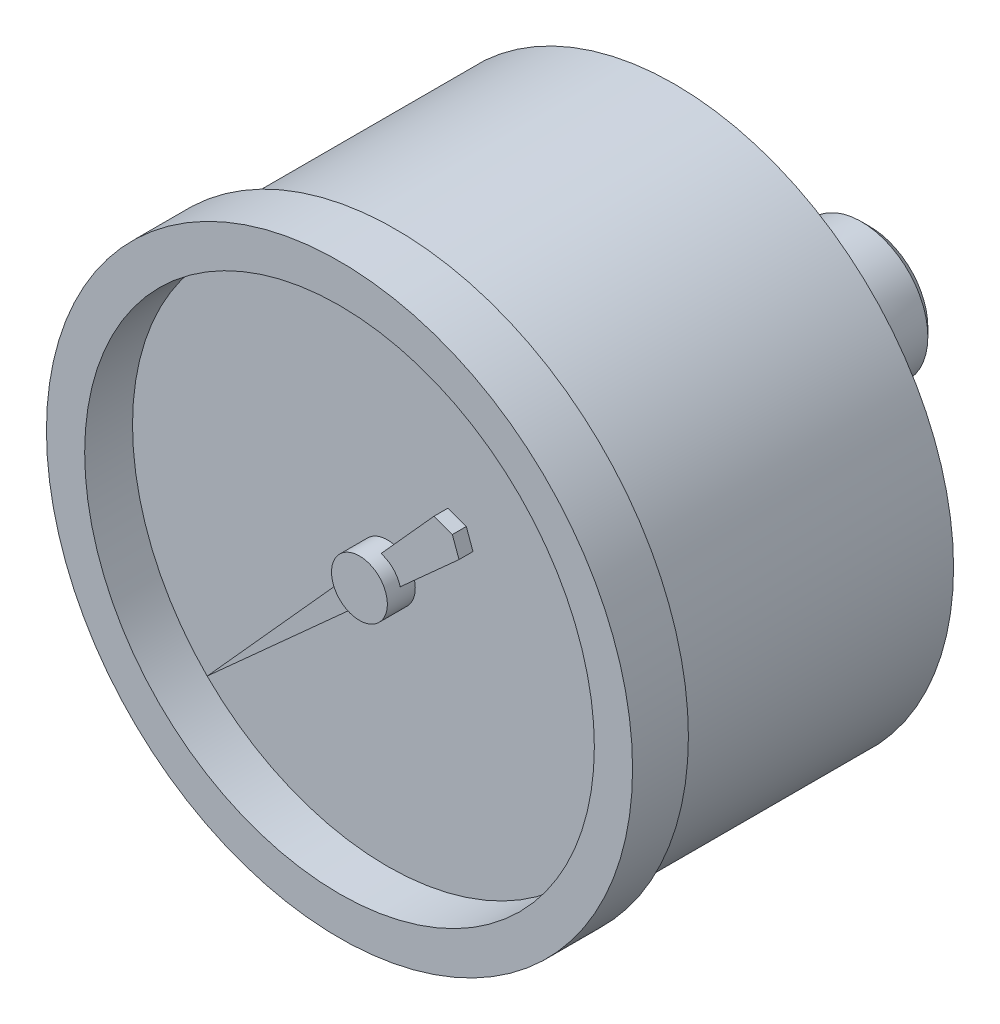
ISO-10303-21;
HEADER;
FILE_DESCRIPTION(('STEP AP214'),'2;1');
FILE_NAME('part.step','',(''),(''),'','','');
FILE_SCHEMA(('AUTOMOTIVE_DESIGN { 1 0 10303 214 1 1 1 1 }'));
ENDSEC;
DATA;
#1=APPLICATION_CONTEXT('core data for automotive mechanical design processes');
#2=APPLICATION_PROTOCOL_DEFINITION('international standard','automotive_design',2000,#1);
#3=PRODUCT_CONTEXT('',#1,'mechanical');
#4=PRODUCT('Part','Part','',(#3));
#5=PRODUCT_RELATED_PRODUCT_CATEGORY('part','',(#4));
#6=PRODUCT_DEFINITION_FORMATION('','',#4);
#7=PRODUCT_DEFINITION_CONTEXT('part definition',#1,'design');
#8=PRODUCT_DEFINITION('design','',#6,#7);
#9=PRODUCT_DEFINITION_SHAPE('','',#8);
#10=(LENGTH_UNIT() NAMED_UNIT(*) SI_UNIT(.MILLI.,.METRE.));
#11=(NAMED_UNIT(*) PLANE_ANGLE_UNIT() SI_UNIT($,.RADIAN.));
#12=(NAMED_UNIT(*) SI_UNIT($,.STERADIAN.) SOLID_ANGLE_UNIT());
#13=UNCERTAINTY_MEASURE_WITH_UNIT(LENGTH_MEASURE(1.E-05),#10,'distance_accuracy_value','');
#14=(GEOMETRIC_REPRESENTATION_CONTEXT(3) GLOBAL_UNCERTAINTY_ASSIGNED_CONTEXT((#13)) GLOBAL_UNIT_ASSIGNED_CONTEXT((#10,
#11,#12)) REPRESENTATION_CONTEXT('',''));
#15=CARTESIAN_POINT('',(0.,0.,0.));
#16=DIRECTION('',(0.,0.,1.));
#17=DIRECTION('',(1.,0.,0.));
#18=AXIS2_PLACEMENT_3D('',#15,#16,#17);
#19=CARTESIAN_POINT('',(0.,0.,0.));
#20=DIRECTION('',(0.,0.,1.));
#21=DIRECTION('',(1.,0.,0.));
#22=AXIS2_PLACEMENT_3D('',#19,#20,#21);
#23=CYLINDRICAL_SURFACE('',#22,7.58620689655172);
#24=CARTESIAN_POINT('',(0.,0.,8.4));
#25=DIRECTION('',(0.,0.,1.));
#26=DIRECTION('',(1.,0.,0.));
#27=AXIS2_PLACEMENT_3D('',#24,#25,#26);
#28=CIRCLE('',#27,7.58620689655172);
#29=CARTESIAN_POINT('',(-5.22499139494879,5.5,8.4));
#30=VERTEX_POINT('',#29);
#31=CARTESIAN_POINT('',(-5.5,5.22499139494879,8.4));
#32=VERTEX_POINT('',#31);
#33=EDGE_CURVE('E187',#30,#32,#28,.T.);
#34=ORIENTED_EDGE('',*,*,#33,.T.);
#35=DIRECTION('',(0.,0.,1.));
#36=VECTOR('',#35,1.);
#37=CARTESIAN_POINT('',(-5.5,5.22499139494879,0.));
#38=LINE('',#37,#36);
#39=CARTESIAN_POINT('',(-5.5,5.22499139494879,14.));
#40=VERTEX_POINT('',#39);
#41=EDGE_CURVE('E262',#32,#40,#38,.T.);
#42=ORIENTED_EDGE('',*,*,#41,.T.);
#43=CARTESIAN_POINT('',(0.,0.,14.));
#44=DIRECTION('',(0.,0.,1.));
#45=DIRECTION('',(1.,0.,0.));
#46=AXIS2_PLACEMENT_3D('',#43,#44,#45);
#47=CIRCLE('',#46,7.58620689655172);
#48=CARTESIAN_POINT('',(-5.22499139494879,5.5,14.));
#49=VERTEX_POINT('',#48);
#50=EDGE_CURVE('E176',#49,#40,#47,.T.);
#51=ORIENTED_EDGE('',*,*,#50,.F.);
#52=DIRECTION('',(0.,0.,1.));
#53=VECTOR('',#52,1.);
#54=CARTESIAN_POINT('',(-5.22499139494879,5.5,0.));
#55=LINE('',#54,#53);
#56=EDGE_CURVE('E153',#49,#30,#55,.F.);
#57=ORIENTED_EDGE('',*,*,#56,.T.);
#58=EDGE_LOOP('',(#34,#42,#51,#57));
#59=FACE_BOUND('',#58,.T.);
#60=ADVANCED_FACE('F35',(#59),#23,.T.);
#61=CARTESIAN_POINT('',(-5.5,-5.22499139494879,14.));
#62=VERTEX_POINT('',#61);
#63=CARTESIAN_POINT('',(-5.22499139494879,-5.5,14.));
#64=VERTEX_POINT('',#63);
#65=EDGE_CURVE('E182',#62,#64,#47,.T.);
#66=ORIENTED_EDGE('',*,*,#65,.F.);
#67=DIRECTION('',(0.,0.,1.));
#68=VECTOR('',#67,1.);
#69=CARTESIAN_POINT('',(-5.5,-5.22499139494879,0.));
#70=LINE('',#69,#68);
#71=CARTESIAN_POINT('',(-5.5,-5.22499139494879,8.4));
#72=VERTEX_POINT('',#71);
#73=EDGE_CURVE('E267',#62,#72,#70,.F.);
#74=ORIENTED_EDGE('',*,*,#73,.T.);
#75=CARTESIAN_POINT('',(-5.22499139494879,-5.5,8.4));
#76=VERTEX_POINT('',#75);
#77=EDGE_CURVE('E190',#72,#76,#28,.T.);
#78=ORIENTED_EDGE('',*,*,#77,.T.);
#79=DIRECTION('',(0.,0.,1.));
#80=VECTOR('',#79,1.);
#81=CARTESIAN_POINT('',(-5.22499139494879,-5.5,0.));
#82=LINE('',#81,#80);
#83=EDGE_CURVE('E58',#76,#64,#82,.T.);
#84=ORIENTED_EDGE('',*,*,#83,.T.);
#85=EDGE_LOOP('',(#66,#74,#78,#84));
#86=FACE_BOUND('',#85,.T.);
#87=ADVANCED_FACE('F283',(#86),#23,.T.);
#88=CARTESIAN_POINT('',(5.22499139494879,-5.5,14.));
#89=VERTEX_POINT('',#88);
#90=CARTESIAN_POINT('',(5.5,-5.22499139494879,14.));
#91=VERTEX_POINT('',#90);
#92=EDGE_CURVE('E178',#89,#91,#47,.T.);
#93=ORIENTED_EDGE('',*,*,#92,.F.);
#94=DIRECTION('',(0.,0.,1.));
#95=VECTOR('',#94,1.);
#96=CARTESIAN_POINT('',(5.22499139494879,-5.5,0.));
#97=LINE('',#96,#95);
#98=CARTESIAN_POINT('',(5.22499139494879,-5.5,8.4));
#99=VERTEX_POINT('',#98);
#100=EDGE_CURVE('E271',#89,#99,#97,.F.);
#101=ORIENTED_EDGE('',*,*,#100,.T.);
#102=CARTESIAN_POINT('',(5.5,-5.22499139494879,8.4));
#103=VERTEX_POINT('',#102);
#104=EDGE_CURVE('E188',#99,#103,#28,.T.);
#105=ORIENTED_EDGE('',*,*,#104,.T.);
#106=DIRECTION('',(0.,0.,1.));
#107=VECTOR('',#106,1.);
#108=CARTESIAN_POINT('',(5.5,-5.22499139494879,0.));
#109=LINE('',#108,#107);
#110=EDGE_CURVE('E50',#103,#91,#109,.T.);
#111=ORIENTED_EDGE('',*,*,#110,.T.);
#112=EDGE_LOOP('',(#93,#101,#105,#111));
#113=FACE_BOUND('',#112,.T.);
#114=ADVANCED_FACE('F325',(#113),#23,.T.);
#115=CARTESIAN_POINT('',(0.,0.,34.5714285714286));
#116=DIRECTION('',(0.,0.,-1.));
#117=DIRECTION('',(-1.,0.,0.));
#118=AXIS2_PLACEMENT_3D('',#115,#116,#117);
#119=PLANE('',#118);
#120=CARTESIAN_POINT('',(0.,0.,34.5714285714286));
#121=DIRECTION('',(0.,0.,1.));
#122=DIRECTION('',(1.,0.,0.));
#123=AXIS2_PLACEMENT_3D('',#120,#121,#122);
#124=CIRCLE('',#123,18.2608695652174);
#125=CARTESIAN_POINT('',(18.2608695652174,0.,34.5714285714286));
#126=VERTEX_POINT('',#125);
#127=EDGE_CURVE('E297',#126,#126,#124,.T.);
#128=ORIENTED_EDGE('',*,*,#127,.T.);
#129=EDGE_LOOP('',(#128));
#130=FACE_BOUND('',#129,.T.);
#131=CARTESIAN_POINT('',(0.,0.,34.5714285714286));
#132=DIRECTION('',(0.,0.,1.));
#133=DIRECTION('',(1.,0.,0.));
#134=AXIS2_PLACEMENT_3D('',#131,#132,#133);
#135=CIRCLE('',#134,2.);
#136=CARTESIAN_POINT('',(-0.7466307905966,-1.85540897446711,34.5714285714286));
#137=VERTEX_POINT('',#136);
#138=CARTESIAN_POINT('',(1.92328901913971,0.548597620170385,34.5714285714286));
#139=VERTEX_POINT('',#138);
#140=EDGE_CURVE('E258',#137,#139,#135,.T.);
#141=ORIENTED_EDGE('',*,*,#140,.F.);
#142=DIRECTION('',(0.743144825477394,0.669130606358858,0.));
#143=VECTOR('',#142,1.);
#144=CARTESIAN_POINT('',(-11.879393923934,-11.879393923934,34.5714285714286));
#145=LINE('',#144,#143);
#146=CARTESIAN_POINT('',(-11.879393923934,-11.879393923934,34.5714285714286));
#147=VERTEX_POINT('',#146);
#148=EDGE_CURVE('E228',#147,#137,#145,.T.);
#149=ORIENTED_EDGE('',*,*,#148,.F.);
#150=DIRECTION('',(-0.669130606358858,-0.743144825477394,0.));
#151=VECTOR('',#150,1.);
#152=CARTESIAN_POINT('',(4.34141195754811,6.13563608865501,34.5714285714286));
#153=LINE('',#152,#151);
#154=CARTESIAN_POINT('',(-1.85540897446711,-0.746630790596598,34.5714285714286));
#155=VERTEX_POINT('',#154);
#156=EDGE_CURVE('E235',#155,#147,#153,.T.);
#157=ORIENTED_EDGE('',*,*,#156,.F.);
#158=CARTESIAN_POINT('',(0.548597620170382,1.92328901913971,34.5714285714286));
#159=VERTEX_POINT('',#158);
#160=EDGE_CURVE('E261',#159,#155,#135,.T.);
#161=ORIENTED_EDGE('',*,*,#160,.F.);
#162=CARTESIAN_POINT('',(4.34141195754811,6.13563608865501,34.5714285714286));
#163=VERTEX_POINT('',#162);
#164=EDGE_CURVE('E232',#163,#159,#153,.T.);
#165=ORIENTED_EDGE('',*,*,#164,.F.);
#166=DIRECTION('',(-0.939692620785909,0.342020143325668,0.));
#167=VECTOR('',#166,1.);
#168=CARTESIAN_POINT('',(5.65685424949238,5.65685424949238,34.5714285714286));
#169=LINE('',#168,#167);
#170=CARTESIAN_POINT('',(5.65685424949238,5.65685424949238,34.5714285714286));
#171=VERTEX_POINT('',#170);
#172=EDGE_CURVE('E221',#171,#163,#169,.T.);
#173=ORIENTED_EDGE('',*,*,#172,.F.);
#174=DIRECTION('',(-0.342020143325667,0.939692620785909,0.));
#175=VECTOR('',#174,1.);
#176=CARTESIAN_POINT('',(6.135636088655,4.34141195754811,34.5714285714286));
#177=LINE('',#176,#175);
#178=CARTESIAN_POINT('',(6.135636088655,4.34141195754811,34.5714285714286));
#179=VERTEX_POINT('',#178);
#180=EDGE_CURVE('E225',#179,#171,#177,.T.);
#181=ORIENTED_EDGE('',*,*,#180,.F.);
#182=EDGE_CURVE('E231',#139,#179,#145,.T.);
#183=ORIENTED_EDGE('',*,*,#182,.F.);
#184=EDGE_LOOP('',(#141,#149,#157,#161,#165,#173,#181,#183));
#185=FACE_BOUND('',#184,.T.);
#186=ADVANCED_FACE('F37',(#130,#185),#119,.F.);
#187=CARTESIAN_POINT('',(4.34141195754811,6.13563608865501,35.5714285714286));
#188=DIRECTION('',(0.743144825477394,-0.669130606358858,0.));
#189=DIRECTION('',(0.669130606358858,0.743144825477394,0.));
#190=AXIS2_PLACEMENT_3D('',#187,#188,#189);
#191=PLANE('',#190);
#192=DIRECTION('',(0.,0.,-1.));
#193=VECTOR('',#192,1.);
#194=CARTESIAN_POINT('',(-1.85540897446711,-0.746630790596598,36.5714285714286));
#195=LINE('',#194,#193);
#196=CARTESIAN_POINT('',(-1.85540897446711,-0.746630790596598,35.5714285714286));
#197=VERTEX_POINT('',#196);
#198=EDGE_CURVE('E245',#155,#197,#195,.F.);
#199=ORIENTED_EDGE('',*,*,#198,.F.);
#200=ORIENTED_EDGE('',*,*,#156,.T.);
#201=DIRECTION('',(0.,0.,-1.));
#202=VECTOR('',#201,1.);
#203=CARTESIAN_POINT('',(-11.879393923934,-11.879393923934,35.5714285714286));
#204=LINE('',#203,#202);
#205=CARTESIAN_POINT('',(-11.879393923934,-11.879393923934,35.5714285714286));
#206=VERTEX_POINT('',#205);
#207=EDGE_CURVE('E208',#206,#147,#204,.T.);
#208=ORIENTED_EDGE('',*,*,#207,.F.);
#209=DIRECTION('',(-0.669130606358858,-0.743144825477394,0.));
#210=VECTOR('',#209,1.);
#211=CARTESIAN_POINT('',(4.34141195754811,6.13563608865501,35.5714285714286));
#212=LINE('',#211,#210);
#213=EDGE_CURVE('E224',#197,#206,#212,.T.);
#214=ORIENTED_EDGE('',*,*,#213,.F.);
#215=EDGE_LOOP('',(#199,#200,#208,#214));
#216=FACE_BOUND('',#215,.T.);
#217=ADVANCED_FACE('F347',(#216),#191,.F.);
#218=DIRECTION('',(0.,0.,-1.));
#219=VECTOR('',#218,1.);
#220=CARTESIAN_POINT('',(0.548597620170381,1.92328901913971,36.5714285714286));
#221=LINE('',#220,#219);
#222=CARTESIAN_POINT('',(0.548597620170381,1.92328901913971,35.5714285714286));
#223=VERTEX_POINT('',#222);
#224=EDGE_CURVE('E251',#223,#159,#221,.T.);
#225=ORIENTED_EDGE('',*,*,#224,.F.);
#226=CARTESIAN_POINT('',(4.34141195754811,6.13563608865501,35.5714285714286));
#227=VERTEX_POINT('',#226);
#228=EDGE_CURVE('E243',#227,#223,#212,.T.);
#229=ORIENTED_EDGE('',*,*,#228,.F.);
#230=DIRECTION('',(0.,0.,-1.));
#231=VECTOR('',#230,1.);
#232=CARTESIAN_POINT('',(4.34141195754811,6.13563608865501,35.5714285714286));
#233=LINE('',#232,#231);
#234=EDGE_CURVE('E217',#227,#163,#233,.T.);
#235=ORIENTED_EDGE('',*,*,#234,.T.);
#236=ORIENTED_EDGE('',*,*,#164,.T.);
#237=EDGE_LOOP('',(#225,#229,#235,#236));
#238=FACE_BOUND('',#237,.T.);
#239=ADVANCED_FACE('F350',(#238),#191,.F.);
#240=CARTESIAN_POINT('',(-11.879393923934,-11.879393923934,35.5714285714286));
#241=DIRECTION('',(-0.669130606358858,0.743144825477394,0.));
#242=DIRECTION('',(-0.743144825477394,-0.669130606358858,0.));
#243=AXIS2_PLACEMENT_3D('',#240,#241,#242);
#244=PLANE('',#243);
#245=DIRECTION('',(0.,0.,-1.));
#246=VECTOR('',#245,1.);
#247=CARTESIAN_POINT('',(1.92328901913971,0.548597620170383,36.5714285714286));
#248=LINE('',#247,#246);
#249=CARTESIAN_POINT('',(1.92328901913971,0.548597620170383,35.5714285714286));
#250=VERTEX_POINT('',#249);
#251=EDGE_CURVE('E254',#139,#250,#248,.F.);
#252=ORIENTED_EDGE('',*,*,#251,.F.);
#253=ORIENTED_EDGE('',*,*,#182,.T.);
#254=DIRECTION('',(0.,0.,-1.));
#255=VECTOR('',#254,1.);
#256=CARTESIAN_POINT('',(6.135636088655,4.34141195754811,35.5714285714286));
#257=LINE('',#256,#255);
#258=CARTESIAN_POINT('',(6.135636088655,4.34141195754811,35.5714285714286));
#259=VERTEX_POINT('',#258);
#260=EDGE_CURVE('E211',#259,#179,#257,.T.);
#261=ORIENTED_EDGE('',*,*,#260,.F.);
#262=DIRECTION('',(0.743144825477394,0.669130606358858,0.));
#263=VECTOR('',#262,1.);
#264=CARTESIAN_POINT('',(-11.879393923934,-11.879393923934,35.5714285714286));
#265=LINE('',#264,#263);
#266=EDGE_CURVE('E242',#250,#259,#265,.T.);
#267=ORIENTED_EDGE('',*,*,#266,.F.);
#268=EDGE_LOOP('',(#252,#253,#261,#267));
#269=FACE_BOUND('',#268,.T.);
#270=ADVANCED_FACE('F352',(#269),#244,.F.);
#271=DIRECTION('',(0.,0.,-1.));
#272=VECTOR('',#271,1.);
#273=CARTESIAN_POINT('',(-0.7466307905966,-1.85540897446711,36.5714285714286));
#274=LINE('',#273,#272);
#275=CARTESIAN_POINT('',(-0.7466307905966,-1.85540897446711,35.5714285714286));
#276=VERTEX_POINT('',#275);
#277=EDGE_CURVE('E248',#276,#137,#274,.T.);
#278=ORIENTED_EDGE('',*,*,#277,.F.);
#279=EDGE_CURVE('E239',#206,#276,#265,.T.);
#280=ORIENTED_EDGE('',*,*,#279,.F.);
#281=ORIENTED_EDGE('',*,*,#207,.T.);
#282=ORIENTED_EDGE('',*,*,#148,.T.);
#283=EDGE_LOOP('',(#278,#280,#281,#282));
#284=FACE_BOUND('',#283,.T.);
#285=ADVANCED_FACE('F355',(#284),#244,.F.);
#286=CARTESIAN_POINT('',(0.,0.,35.5714285714286));
#287=DIRECTION('',(0.,0.,-1.));
#288=DIRECTION('',(-1.,0.,0.));
#289=AXIS2_PLACEMENT_3D('',#286,#287,#288);
#290=PLANE('',#289);
#291=CARTESIAN_POINT('',(0.,0.,35.5714285714286));
#292=DIRECTION('',(0.,0.,-1.));
#293=DIRECTION('',(-1.,0.,0.));
#294=AXIS2_PLACEMENT_3D('',#291,#292,#293);
#295=CIRCLE('',#294,2.);
#296=EDGE_CURVE('E293',#197,#276,#295,.F.);
#297=ORIENTED_EDGE('',*,*,#296,.F.);
#298=ORIENTED_EDGE('',*,*,#213,.T.);
#299=ORIENTED_EDGE('',*,*,#279,.T.);
#300=EDGE_LOOP('',(#297,#298,#299));
#301=FACE_BOUND('',#300,.T.);
#302=ADVANCED_FACE('F365',(#301),#290,.F.);
#303=EDGE_CURVE('E294',#250,#223,#295,.F.);
#304=ORIENTED_EDGE('',*,*,#303,.F.);
#305=ORIENTED_EDGE('',*,*,#266,.T.);
#306=DIRECTION('',(-0.342020143325667,0.939692620785909,0.));
#307=VECTOR('',#306,1.);
#308=CARTESIAN_POINT('',(6.135636088655,4.34141195754811,35.5714285714286));
#309=LINE('',#308,#307);
#310=CARTESIAN_POINT('',(5.65685424949238,5.65685424949238,35.5714285714286));
#311=VERTEX_POINT('',#310);
#312=EDGE_CURVE('E237',#259,#311,#309,.T.);
#313=ORIENTED_EDGE('',*,*,#312,.T.);
#314=DIRECTION('',(-0.939692620785909,0.342020143325668,0.));
#315=VECTOR('',#314,1.);
#316=CARTESIAN_POINT('',(5.65685424949238,5.65685424949238,35.5714285714286));
#317=LINE('',#316,#315);
#318=EDGE_CURVE('E220',#311,#227,#317,.T.);
#319=ORIENTED_EDGE('',*,*,#318,.T.);
#320=ORIENTED_EDGE('',*,*,#228,.T.);
#321=EDGE_LOOP('',(#304,#305,#313,#319,#320));
#322=FACE_BOUND('',#321,.T.);
#323=ADVANCED_FACE('F368',(#322),#290,.F.);
#324=CARTESIAN_POINT('',(0.,0.,0.));
#325=DIRECTION('',(0.,0.,1.));
#326=DIRECTION('',(1.,0.,0.));
#327=AXIS2_PLACEMENT_3D('',#324,#325,#326);
#328=CYLINDRICAL_SURFACE('',#327,18.2608695652174);
#329=ORIENTED_EDGE('',*,*,#127,.F.);
#330=EDGE_LOOP('',(#329));
#331=FACE_BOUND('',#330,.T.);
#332=CARTESIAN_POINT('',(0.,0.,38.));
#333=DIRECTION('',(0.,0.,1.));
#334=DIRECTION('',(1.,0.,0.));
#335=AXIS2_PLACEMENT_3D('',#332,#333,#334);
#336=CIRCLE('',#335,18.2608695652174);
#337=CARTESIAN_POINT('',(18.2608695652174,0.,38.));
#338=VERTEX_POINT('',#337);
#339=EDGE_CURVE('E300',#338,#338,#336,.T.);
#340=ORIENTED_EDGE('',*,*,#339,.T.);
#341=EDGE_LOOP('',(#340));
#342=FACE_BOUND('',#341,.T.);
#343=ADVANCED_FACE('F414',(#331,#342),#328,.F.);
#344=CARTESIAN_POINT('',(0.,18.2608695652174,38.));
#345=DIRECTION('',(0.,0.,-1.));
#346=DIRECTION('',(-1.,0.,0.));
#347=AXIS2_PLACEMENT_3D('',#344,#345,#346);
#348=PLANE('',#347);
#349=ORIENTED_EDGE('',*,*,#339,.F.);
#350=EDGE_LOOP('',(#349));
#351=FACE_BOUND('',#350,.T.);
#352=CARTESIAN_POINT('',(0.,0.,38.));
#353=DIRECTION('',(0.,0.,1.));
#354=DIRECTION('',(1.,0.,0.));
#355=AXIS2_PLACEMENT_3D('',#352,#353,#354);
#356=CIRCLE('',#355,21.);
#357=CARTESIAN_POINT('',(21.,0.,38.));
#358=VERTEX_POINT('',#357);
#359=EDGE_CURVE('E303',#358,#358,#356,.T.);
#360=ORIENTED_EDGE('',*,*,#359,.T.);
#361=EDGE_LOOP('',(#360));
#362=FACE_BOUND('',#361,.T.);
#363=ADVANCED_FACE('F419',(#351,#362),#348,.F.);
#364=CARTESIAN_POINT('',(0.,0.,0.));
#365=DIRECTION('',(0.,0.,1.));
#366=DIRECTION('',(1.,0.,0.));
#367=AXIS2_PLACEMENT_3D('',#364,#365,#366);
#368=CYLINDRICAL_SURFACE('',#367,21.);
#369=ORIENTED_EDGE('',*,*,#359,.F.);
#370=EDGE_LOOP('',(#369));
#371=FACE_BOUND('',#370,.T.);
#372=CARTESIAN_POINT('',(0.,0.,34.));
#373=DIRECTION('',(0.,0.,1.));
#374=DIRECTION('',(1.,0.,0.));
#375=AXIS2_PLACEMENT_3D('',#372,#373,#374);
#376=CIRCLE('',#375,21.);
#377=CARTESIAN_POINT('',(21.,0.,34.));
#378=VERTEX_POINT('',#377);
#379=EDGE_CURVE('E306',#378,#378,#376,.T.);
#380=ORIENTED_EDGE('',*,*,#379,.T.);
#381=EDGE_LOOP('',(#380));
#382=FACE_BOUND('',#381,.T.);
#383=ADVANCED_FACE('F429',(#371,#382),#368,.T.);
#384=CARTESIAN_POINT('',(0.,21.,34.));
#385=DIRECTION('',(0.,0.,1.));
#386=DIRECTION('',(1.,0.,0.));
#387=AXIS2_PLACEMENT_3D('',#384,#385,#386);
#388=PLANE('',#387);
#389=ORIENTED_EDGE('',*,*,#379,.F.);
#390=EDGE_LOOP('',(#389));
#391=FACE_BOUND('',#390,.T.);
#392=CARTESIAN_POINT('',(0.,0.,34.));
#393=DIRECTION('',(0.,0.,1.));
#394=DIRECTION('',(1.,0.,0.));
#395=AXIS2_PLACEMENT_3D('',#392,#393,#394);
#396=CIRCLE('',#395,20.);
#397=CARTESIAN_POINT('',(20.,0.,34.));
#398=VERTEX_POINT('',#397);
#399=EDGE_CURVE('E180',#398,#398,#396,.T.);
#400=ORIENTED_EDGE('',*,*,#399,.T.);
#401=EDGE_LOOP('',(#400));
#402=FACE_BOUND('',#401,.T.);
#403=ADVANCED_FACE('F312',(#391,#402),#388,.F.);
#404=CARTESIAN_POINT('',(0.,0.,0.));
#405=DIRECTION('',(0.,0.,1.));
#406=DIRECTION('',(1.,0.,0.));
#407=AXIS2_PLACEMENT_3D('',#404,#405,#406);
#408=CYLINDRICAL_SURFACE('',#407,20.);
#409=ORIENTED_EDGE('',*,*,#399,.F.);
#410=EDGE_LOOP('',(#409));
#411=FACE_BOUND('',#410,.T.);
#412=CARTESIAN_POINT('',(0.,0.,14.));
#413=DIRECTION('',(0.,0.,1.));
#414=DIRECTION('',(1.,0.,0.));
#415=AXIS2_PLACEMENT_3D('',#412,#413,#414);
#416=CIRCLE('',#415,20.);
#417=CARTESIAN_POINT('',(20.,0.,14.));
#418=VERTEX_POINT('',#417);
#419=EDGE_CURVE('E175',#418,#418,#416,.T.);
#420=ORIENTED_EDGE('',*,*,#419,.T.);
#421=EDGE_LOOP('',(#420));
#422=FACE_BOUND('',#421,.T.);
#423=ADVANCED_FACE('F314',(#411,#422),#408,.T.);
#424=CARTESIAN_POINT('',(0.,20.,14.));
#425=DIRECTION('',(0.,0.,1.));
#426=DIRECTION('',(1.,0.,0.));
#427=AXIS2_PLACEMENT_3D('',#424,#425,#426);
#428=PLANE('',#427);
#429=DIRECTION('',(0.,-1.,0.));
#430=VECTOR('',#429,1.);
#431=CARTESIAN_POINT('',(-5.5,5.5,14.));
#432=LINE('',#431,#430);
#433=EDGE_CURVE('E279',#40,#62,#432,.T.);
#434=ORIENTED_EDGE('',*,*,#433,.T.);
#435=ORIENTED_EDGE('',*,*,#65,.T.);
#436=DIRECTION('',(1.,0.,0.));
#437=VECTOR('',#436,1.);
#438=CARTESIAN_POINT('',(-5.5,-5.5,14.));
#439=LINE('',#438,#437);
#440=EDGE_CURVE('E277',#64,#89,#439,.T.);
#441=ORIENTED_EDGE('',*,*,#440,.T.);
#442=ORIENTED_EDGE('',*,*,#92,.T.);
#443=DIRECTION('',(0.,1.,0.));
#444=VECTOR('',#443,1.);
#445=CARTESIAN_POINT('',(5.5,-5.5,14.));
#446=LINE('',#445,#444);
#447=CARTESIAN_POINT('',(5.5,5.22499139494879,14.));
#448=VERTEX_POINT('',#447);
#449=EDGE_CURVE('E158',#91,#448,#446,.T.);
#450=ORIENTED_EDGE('',*,*,#449,.T.);
#451=CARTESIAN_POINT('',(5.22499139494879,5.5,14.));
#452=VERTEX_POINT('',#451);
#453=EDGE_CURVE('E165',#448,#452,#47,.T.);
#454=ORIENTED_EDGE('',*,*,#453,.T.);
#455=DIRECTION('',(-1.,0.,0.));
#456=VECTOR('',#455,1.);
#457=CARTESIAN_POINT('',(5.5,5.5,14.));
#458=LINE('',#457,#456);
#459=EDGE_CURVE('E147',#452,#49,#458,.T.);
#460=ORIENTED_EDGE('',*,*,#459,.T.);
#461=ORIENTED_EDGE('',*,*,#50,.T.);
#462=EDGE_LOOP('',(#434,#435,#441,#442,#450,#454,#460,#461));
#463=FACE_BOUND('',#462,.T.);
#464=ORIENTED_EDGE('',*,*,#419,.F.);
#465=EDGE_LOOP('',(#464));
#466=FACE_BOUND('',#465,.T.);
#467=ADVANCED_FACE('F172',(#463,#466),#428,.F.);
#468=ORIENTED_EDGE('',*,*,#453,.F.);
#469=DIRECTION('',(0.,0.,1.));
#470=VECTOR('',#469,1.);
#471=CARTESIAN_POINT('',(5.5,5.22499139494879,0.));
#472=LINE('',#471,#470);
#473=CARTESIAN_POINT('',(5.5,5.22499139494879,8.4));
#474=VERTEX_POINT('',#473);
#475=EDGE_CURVE('E168',#448,#474,#472,.F.);
#476=ORIENTED_EDGE('',*,*,#475,.T.);
#477=CARTESIAN_POINT('',(5.22499139494879,5.5,8.4));
#478=VERTEX_POINT('',#477);
#479=EDGE_CURVE('E167',#474,#478,#28,.T.);
#480=ORIENTED_EDGE('',*,*,#479,.T.);
#481=DIRECTION('',(0.,0.,1.));
#482=VECTOR('',#481,1.);
#483=CARTESIAN_POINT('',(5.22499139494879,5.5,0.));
#484=LINE('',#483,#482);
#485=EDGE_CURVE('E150',#478,#452,#484,.T.);
#486=ORIENTED_EDGE('',*,*,#485,.T.);
#487=EDGE_LOOP('',(#468,#476,#480,#486));
#488=FACE_BOUND('',#487,.T.);
#489=ADVANCED_FACE('F163',(#488),#23,.T.);
#490=CARTESIAN_POINT('',(0.,7.58620689655172,8.4));
#491=DIRECTION('',(0.,0.,1.));
#492=DIRECTION('',(1.,0.,0.));
#493=AXIS2_PLACEMENT_3D('',#490,#491,#492);
#494=PLANE('',#493);
#495=ORIENTED_EDGE('',*,*,#77,.F.);
#496=DIRECTION('',(0.,1.,0.));
#497=VECTOR('',#496,1.);
#498=CARTESIAN_POINT('',(-5.5,7.58620689655172,8.4));
#499=LINE('',#498,#497);
#500=EDGE_CURVE('E11',#72,#32,#499,.T.);
#501=ORIENTED_EDGE('',*,*,#500,.T.);
#502=ORIENTED_EDGE('',*,*,#33,.F.);
#503=DIRECTION('',(1.,0.,0.));
#504=VECTOR('',#503,1.);
#505=CARTESIAN_POINT('',(0.,5.5,8.4));
#506=LINE('',#505,#504);
#507=EDGE_CURVE('E289',#30,#478,#506,.T.);
#508=ORIENTED_EDGE('',*,*,#507,.T.);
#509=ORIENTED_EDGE('',*,*,#479,.F.);
#510=DIRECTION('',(0.,-1.,0.));
#511=VECTOR('',#510,1.);
#512=CARTESIAN_POINT('',(5.5,7.58620689655172,8.4));
#513=LINE('',#512,#511);
#514=EDGE_CURVE('E288',#474,#103,#513,.T.);
#515=ORIENTED_EDGE('',*,*,#514,.T.);
#516=ORIENTED_EDGE('',*,*,#104,.F.);
#517=DIRECTION('',(-1.,0.,0.));
#518=VECTOR('',#517,1.);
#519=CARTESIAN_POINT('',(0.,-5.5,8.4));
#520=LINE('',#519,#518);
#521=EDGE_CURVE('E43',#99,#76,#520,.T.);
#522=ORIENTED_EDGE('',*,*,#521,.T.);
#523=EDGE_LOOP('',(#495,#501,#502,#508,#509,#515,#516,#522));
#524=FACE_BOUND('',#523,.T.);
#525=CARTESIAN_POINT('',(0.,0.,8.4));
#526=DIRECTION('',(0.,0.,1.));
#527=DIRECTION('',(1.,0.,0.));
#528=AXIS2_PLACEMENT_3D('',#525,#526,#527);
#529=CIRCLE('',#528,5.00150687149812);
#530=CARTESIAN_POINT('',(5.00150687149812,0.,8.4));
#531=VERTEX_POINT('',#530);
#532=EDGE_CURVE('E193',#531,#531,#529,.T.);
#533=ORIENTED_EDGE('',*,*,#532,.T.);
#534=EDGE_LOOP('',(#533));
#535=FACE_BOUND('',#534,.T.);
#536=ADVANCED_FACE('F286',(#524,#535),#494,.F.);
#537=CARTESIAN_POINT('',(0.,0.,0.600035703328246));
#538=DIRECTION('',(0.,0.,1.));
#539=DIRECTION('',(1.,0.,0.));
#540=AXIS2_PLACEMENT_3D('',#537,#538,#539);
#541=CONICAL_SURFACE('',#540,4.75774580599075,0.0312413936106987);
#542=ORIENTED_EDGE('',*,*,#532,.F.);
#543=EDGE_LOOP('',(#542));
#544=FACE_BOUND('',#543,.T.);
#545=CARTESIAN_POINT('',(0.,0.,0.600035703328246));
#546=DIRECTION('',(0.,0.,1.));
#547=DIRECTION('',(1.,0.,0.));
#548=AXIS2_PLACEMENT_3D('',#545,#546,#547);
#549=CIRCLE('',#548,4.75774580599075);
#550=CARTESIAN_POINT('',(4.75774580599075,0.,0.600035703328246));
#551=VERTEX_POINT('',#550);
#552=EDGE_CURVE('E199',#551,#551,#549,.T.);
#553=ORIENTED_EDGE('',*,*,#552,.T.);
#554=EDGE_LOOP('',(#553));
#555=FACE_BOUND('',#554,.T.);
#556=ADVANCED_FACE('F334',(#544,#555),#541,.T.);
#557=CARTESIAN_POINT('',(0.,0.,0.));
#558=DIRECTION('',(0.,0.,1.));
#559=DIRECTION('',(1.,0.,0.));
#560=AXIS2_PLACEMENT_3D('',#557,#558,#559);
#561=CONICAL_SURFACE('',#560,4.15771010266251,0.785398163397448);
#562=ORIENTED_EDGE('',*,*,#552,.F.);
#563=EDGE_LOOP('',(#562));
#564=FACE_BOUND('',#563,.T.);
#565=CARTESIAN_POINT('',(0.,0.,0.));
#566=DIRECTION('',(0.,0.,1.));
#567=DIRECTION('',(1.,0.,0.));
#568=AXIS2_PLACEMENT_3D('',#565,#566,#567);
#569=CIRCLE('',#568,4.15771010266251);
#570=CARTESIAN_POINT('',(4.15771010266251,0.,0.));
#571=VERTEX_POINT('',#570);
#572=EDGE_CURVE('E203',#571,#571,#569,.T.);
#573=ORIENTED_EDGE('',*,*,#572,.T.);
#574=EDGE_LOOP('',(#573));
#575=FACE_BOUND('',#574,.T.);
#576=ADVANCED_FACE('F337',(#564,#575),#561,.T.);
#577=CARTESIAN_POINT('',(0.,4.15771010266251,0.));
#578=DIRECTION('',(0.,0.,1.));
#579=DIRECTION('',(1.,0.,0.));
#580=AXIS2_PLACEMENT_3D('',#577,#578,#579);
#581=PLANE('',#580);
#582=ORIENTED_EDGE('',*,*,#572,.F.);
#583=EDGE_LOOP('',(#582));
#584=FACE_BOUND('',#583,.T.);
#585=ADVANCED_FACE('F341',(#584),#581,.F.);
#586=CARTESIAN_POINT('',(6.135636088655,4.34141195754811,35.5714285714286));
#587=DIRECTION('',(-0.939692620785909,-0.342020143325667,0.));
#588=DIRECTION('',(0.342020143325667,-0.939692620785909,0.));
#589=AXIS2_PLACEMENT_3D('',#586,#587,#588);
#590=PLANE('',#589);
#591=ORIENTED_EDGE('',*,*,#180,.T.);
#592=DIRECTION('',(0.,0.,-1.));
#593=VECTOR('',#592,1.);
#594=CARTESIAN_POINT('',(5.65685424949238,5.65685424949238,35.5714285714286));
#595=LINE('',#594,#593);
#596=EDGE_CURVE('E214',#311,#171,#595,.T.);
#597=ORIENTED_EDGE('',*,*,#596,.F.);
#598=ORIENTED_EDGE('',*,*,#312,.F.);
#599=ORIENTED_EDGE('',*,*,#260,.T.);
#600=EDGE_LOOP('',(#591,#597,#598,#599));
#601=FACE_BOUND('',#600,.T.);
#602=ADVANCED_FACE('F345',(#601),#590,.F.);
#603=CARTESIAN_POINT('',(5.65685424949238,5.65685424949238,35.5714285714286));
#604=DIRECTION('',(-0.342020143325668,-0.939692620785909,0.));
#605=DIRECTION('',(0.939692620785909,-0.342020143325668,0.));
#606=AXIS2_PLACEMENT_3D('',#603,#604,#605);
#607=PLANE('',#606);
#608=ORIENTED_EDGE('',*,*,#172,.T.);
#609=ORIENTED_EDGE('',*,*,#234,.F.);
#610=ORIENTED_EDGE('',*,*,#318,.F.);
#611=ORIENTED_EDGE('',*,*,#596,.T.);
#612=EDGE_LOOP('',(#608,#609,#610,#611));
#613=FACE_BOUND('',#612,.T.);
#614=ADVANCED_FACE('F359',(#613),#607,.F.);
#615=CARTESIAN_POINT('',(0.,0.,36.5714285714286));
#616=DIRECTION('',(0.,0.,-1.));
#617=DIRECTION('',(-1.,0.,0.));
#618=AXIS2_PLACEMENT_3D('',#615,#616,#617);
#619=CYLINDRICAL_SURFACE('',#618,2.);
#620=CARTESIAN_POINT('',(0.,0.,36.5714285714286));
#621=DIRECTION('',(0.,0.,1.));
#622=DIRECTION('',(1.,0.,0.));
#623=AXIS2_PLACEMENT_3D('',#620,#621,#622);
#624=CIRCLE('',#623,2.);
#625=CARTESIAN_POINT('',(2.,0.,36.5714285714286));
#626=VERTEX_POINT('',#625);
#627=EDGE_CURVE('E257',#626,#626,#624,.T.);
#628=ORIENTED_EDGE('',*,*,#627,.F.);
#629=EDGE_LOOP('',(#628));
#630=FACE_BOUND('',#629,.T.);
#631=ORIENTED_EDGE('',*,*,#160,.T.);
#632=ORIENTED_EDGE('',*,*,#198,.T.);
#633=ORIENTED_EDGE('',*,*,#296,.T.);
#634=ORIENTED_EDGE('',*,*,#277,.T.);
#635=ORIENTED_EDGE('',*,*,#140,.T.);
#636=ORIENTED_EDGE('',*,*,#251,.T.);
#637=ORIENTED_EDGE('',*,*,#303,.T.);
#638=ORIENTED_EDGE('',*,*,#224,.T.);
#639=EDGE_LOOP('',(#631,#632,#633,#634,#635,#636,#637,#638));
#640=FACE_BOUND('',#639,.T.);
#641=ADVANCED_FACE('F363',(#630,#640),#619,.T.);
#642=CARTESIAN_POINT('',(0.,0.,36.5714285714286));
#643=DIRECTION('',(0.,0.,1.));
#644=DIRECTION('',(1.,0.,0.));
#645=AXIS2_PLACEMENT_3D('',#642,#643,#644);
#646=PLANE('',#645);
#647=ORIENTED_EDGE('',*,*,#627,.T.);
#648=EDGE_LOOP('',(#647));
#649=FACE_BOUND('',#648,.T.);
#650=ADVANCED_FACE('F372',(#649),#646,.T.);
#651=CARTESIAN_POINT('',(5.5,5.5,14.));
#652=DIRECTION('',(0.,-1.,0.));
#653=DIRECTION('',(0.,0.,-1.));
#654=AXIS2_PLACEMENT_3D('',#651,#652,#653);
#655=PLANE('',#654);
#656=ORIENTED_EDGE('',*,*,#507,.F.);
#657=ORIENTED_EDGE('',*,*,#56,.F.);
#658=ORIENTED_EDGE('',*,*,#459,.F.);
#659=ORIENTED_EDGE('',*,*,#485,.F.);
#660=EDGE_LOOP('',(#656,#657,#658,#659));
#661=FACE_BOUND('',#660,.T.);
#662=ADVANCED_FACE('F149',(#661),#655,.F.);
#663=CARTESIAN_POINT('',(5.5,-5.5,14.));
#664=DIRECTION('',(-1.,0.,0.));
#665=DIRECTION('',(0.,0.,1.));
#666=AXIS2_PLACEMENT_3D('',#663,#664,#665);
#667=PLANE('',#666);
#668=ORIENTED_EDGE('',*,*,#514,.F.);
#669=ORIENTED_EDGE('',*,*,#475,.F.);
#670=ORIENTED_EDGE('',*,*,#449,.F.);
#671=ORIENTED_EDGE('',*,*,#110,.F.);
#672=EDGE_LOOP('',(#668,#669,#670,#671));
#673=FACE_BOUND('',#672,.T.);
#674=ADVANCED_FACE('F383',(#673),#667,.F.);
#675=CARTESIAN_POINT('',(-5.5,-5.5,14.));
#676=DIRECTION('',(0.,1.,0.));
#677=DIRECTION('',(0.,0.,1.));
#678=AXIS2_PLACEMENT_3D('',#675,#676,#677);
#679=PLANE('',#678);
#680=ORIENTED_EDGE('',*,*,#521,.F.);
#681=ORIENTED_EDGE('',*,*,#100,.F.);
#682=ORIENTED_EDGE('',*,*,#440,.F.);
#683=ORIENTED_EDGE('',*,*,#83,.F.);
#684=EDGE_LOOP('',(#680,#681,#682,#683));
#685=FACE_BOUND('',#684,.T.);
#686=ADVANCED_FACE('F380',(#685),#679,.F.);
#687=CARTESIAN_POINT('',(-5.5,5.5,14.));
#688=DIRECTION('',(1.,0.,0.));
#689=DIRECTION('',(0.,0.,-1.));
#690=AXIS2_PLACEMENT_3D('',#687,#688,#689);
#691=PLANE('',#690);
#692=ORIENTED_EDGE('',*,*,#500,.F.);
#693=ORIENTED_EDGE('',*,*,#73,.F.);
#694=ORIENTED_EDGE('',*,*,#433,.F.);
#695=ORIENTED_EDGE('',*,*,#41,.F.);
#696=EDGE_LOOP('',(#692,#693,#694,#695));
#697=FACE_BOUND('',#696,.T.);
#698=ADVANCED_FACE('F377',(#697),#691,.F.);
#699=CLOSED_SHELL('',(#60,#87,#114,#186,#217,#239,#270,#285,#302,#323,#343,#363,#383,#403,#423,
#467,#489,#536,#556,#576,#585,#602,#614,#641,#650,#662,#674,#686,#698));
#700=MANIFOLD_SOLID_BREP('B2',#699);
#701=ADVANCED_BREP_SHAPE_REPRESENTATION('',(#18,#700),#14);
#702=SHAPE_DEFINITION_REPRESENTATION(#9,#701);
ENDSEC;
END-ISO-10303-21;
